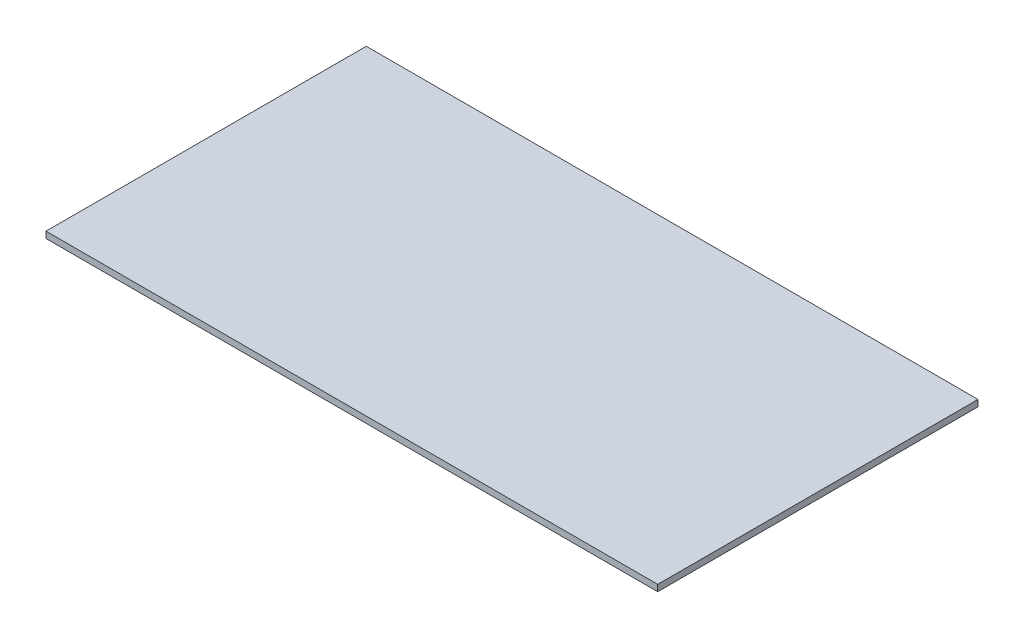
ISO-10303-21;
HEADER;
FILE_DESCRIPTION(('STEP AP214'),'2;1');
FILE_NAME('part.step','',(''),(''),'','','');
FILE_SCHEMA(('AUTOMOTIVE_DESIGN { 1 0 10303 214 1 1 1 1 }'));
ENDSEC;
DATA;
#1=APPLICATION_CONTEXT('core data for automotive mechanical design processes');
#2=APPLICATION_PROTOCOL_DEFINITION('international standard','automotive_design',2000,#1);
#3=PRODUCT_CONTEXT('',#1,'mechanical');
#4=PRODUCT('Part','Part','',(#3));
#5=PRODUCT_RELATED_PRODUCT_CATEGORY('part','',(#4));
#6=PRODUCT_DEFINITION_FORMATION('','',#4);
#7=PRODUCT_DEFINITION_CONTEXT('part definition',#1,'design');
#8=PRODUCT_DEFINITION('design','',#6,#7);
#9=PRODUCT_DEFINITION_SHAPE('','',#8);
#10=(LENGTH_UNIT() NAMED_UNIT(*) SI_UNIT(.MILLI.,.METRE.));
#11=(NAMED_UNIT(*) PLANE_ANGLE_UNIT() SI_UNIT($,.RADIAN.));
#12=(NAMED_UNIT(*) SI_UNIT($,.STERADIAN.) SOLID_ANGLE_UNIT());
#13=UNCERTAINTY_MEASURE_WITH_UNIT(LENGTH_MEASURE(1.E-05),#10,'distance_accuracy_value','');
#14=(GEOMETRIC_REPRESENTATION_CONTEXT(3) GLOBAL_UNCERTAINTY_ASSIGNED_CONTEXT((#13)) GLOBAL_UNIT_ASSIGNED_CONTEXT((#10,
#11,#12)) REPRESENTATION_CONTEXT('',''));
#15=CARTESIAN_POINT('',(0.,0.,0.));
#16=DIRECTION('',(0.,0.,1.));
#17=DIRECTION('',(1.,0.,0.));
#18=AXIS2_PLACEMENT_3D('',#15,#16,#17);
#19=CARTESIAN_POINT('',(-53.3215199226965,2.,-25.6912777809356));
#20=DIRECTION('',(1.,0.,0.));
#21=DIRECTION('',(0.,0.,-1.));
#22=AXIS2_PLACEMENT_3D('',#19,#20,#21);
#23=PLANE('',#22);
#24=DIRECTION('',(0.,0.,1.));
#25=VECTOR('',#24,1.);
#26=CARTESIAN_POINT('',(-53.3215199226965,0.,-25.6912777809356));
#27=LINE('',#26,#25);
#28=CARTESIAN_POINT('',(-53.3215199226965,0.,-25.6912777809356));
#29=VERTEX_POINT('',#28);
#30=CARTESIAN_POINT('',(-53.3215199226965,0.,74.3087222190644));
#31=VERTEX_POINT('',#30);
#32=EDGE_CURVE('E98',#29,#31,#27,.T.);
#33=ORIENTED_EDGE('',*,*,#32,.T.);
#34=DIRECTION('',(0.,-1.,0.));
#35=VECTOR('',#34,1.);
#36=CARTESIAN_POINT('',(-53.3215199226965,2.,74.3087222190644));
#37=LINE('',#36,#35);
#38=CARTESIAN_POINT('',(-53.3215199226965,2.,74.3087222190644));
#39=VERTEX_POINT('',#38);
#40=EDGE_CURVE('E11',#39,#31,#37,.T.);
#41=ORIENTED_EDGE('',*,*,#40,.F.);
#42=DIRECTION('',(0.,0.,1.));
#43=VECTOR('',#42,1.);
#44=CARTESIAN_POINT('',(-53.3215199226965,2.,-25.6912777809356));
#45=LINE('',#44,#43);
#46=CARTESIAN_POINT('',(-53.3215199226965,2.,-25.6912777809356));
#47=VERTEX_POINT('',#46);
#48=EDGE_CURVE('E86',#47,#39,#45,.T.);
#49=ORIENTED_EDGE('',*,*,#48,.F.);
#50=DIRECTION('',(0.,-1.,0.));
#51=VECTOR('',#50,1.);
#52=CARTESIAN_POINT('',(-53.3215199226965,2.,-25.6912777809356));
#53=LINE('',#52,#51);
#54=EDGE_CURVE('E94',#47,#29,#53,.T.);
#55=ORIENTED_EDGE('',*,*,#54,.T.);
#56=EDGE_LOOP('',(#33,#41,#49,#55));
#57=FACE_BOUND('',#56,.T.);
#58=ADVANCED_FACE('F35',(#57),#23,.F.);
#59=CARTESIAN_POINT('',(-53.3215199226965,2.,74.3087222190644));
#60=DIRECTION('',(0.,0.,-1.));
#61=DIRECTION('',(-1.,0.,0.));
#62=AXIS2_PLACEMENT_3D('',#59,#60,#61);
#63=PLANE('',#62);
#64=DIRECTION('',(1.,0.,0.));
#65=VECTOR('',#64,1.);
#66=CARTESIAN_POINT('',(-53.3215199226965,0.,74.3087222190644));
#67=LINE('',#66,#65);
#68=CARTESIAN_POINT('',(137.678480077303,0.,74.3087222190644));
#69=VERTEX_POINT('',#68);
#70=EDGE_CURVE('E90',#31,#69,#67,.T.);
#71=ORIENTED_EDGE('',*,*,#70,.T.);
#72=DIRECTION('',(0.,-1.,0.));
#73=VECTOR('',#72,1.);
#74=CARTESIAN_POINT('',(137.678480077303,2.,74.3087222190644));
#75=LINE('',#74,#73);
#76=CARTESIAN_POINT('',(137.678480077303,2.,74.3087222190644));
#77=VERTEX_POINT('',#76);
#78=EDGE_CURVE('E43',#77,#69,#75,.T.);
#79=ORIENTED_EDGE('',*,*,#78,.F.);
#80=DIRECTION('',(1.,0.,0.));
#81=VECTOR('',#80,1.);
#82=CARTESIAN_POINT('',(-53.3215199226965,2.,74.3087222190644));
#83=LINE('',#82,#81);
#84=EDGE_CURVE('E81',#39,#77,#83,.T.);
#85=ORIENTED_EDGE('',*,*,#84,.F.);
#86=ORIENTED_EDGE('',*,*,#40,.T.);
#87=EDGE_LOOP('',(#71,#79,#85,#86));
#88=FACE_BOUND('',#87,.T.);
#89=ADVANCED_FACE('F89',(#88),#63,.F.);
#90=CARTESIAN_POINT('',(137.678480077303,2.,-25.6912777809356));
#91=DIRECTION('',(-1.,0.,0.));
#92=DIRECTION('',(0.,0.,1.));
#93=AXIS2_PLACEMENT_3D('',#90,#91,#92);
#94=PLANE('',#93);
#95=DIRECTION('',(0.,0.,-1.));
#96=VECTOR('',#95,1.);
#97=CARTESIAN_POINT('',(137.678480077303,0.,-25.6912777809356));
#98=LINE('',#97,#96);
#99=CARTESIAN_POINT('',(137.678480077303,0.,-25.6912777809356));
#100=VERTEX_POINT('',#99);
#101=EDGE_CURVE('E68',#69,#100,#98,.T.);
#102=ORIENTED_EDGE('',*,*,#101,.T.);
#103=DIRECTION('',(0.,-1.,0.));
#104=VECTOR('',#103,1.);
#105=CARTESIAN_POINT('',(137.678480077303,2.,-25.6912777809356));
#106=LINE('',#105,#104);
#107=CARTESIAN_POINT('',(137.678480077303,2.,-25.6912777809356));
#108=VERTEX_POINT('',#107);
#109=EDGE_CURVE('E91',#108,#100,#106,.T.);
#110=ORIENTED_EDGE('',*,*,#109,.F.);
#111=DIRECTION('',(0.,0.,-1.));
#112=VECTOR('',#111,1.);
#113=CARTESIAN_POINT('',(137.678480077303,2.,-25.6912777809356));
#114=LINE('',#113,#112);
#115=EDGE_CURVE('E84',#77,#108,#114,.T.);
#116=ORIENTED_EDGE('',*,*,#115,.F.);
#117=ORIENTED_EDGE('',*,*,#78,.T.);
#118=EDGE_LOOP('',(#102,#110,#116,#117));
#119=FACE_BOUND('',#118,.T.);
#120=ADVANCED_FACE('F92',(#119),#94,.F.);
#121=CARTESIAN_POINT('',(-53.3215199226965,2.,-25.6912777809356));
#122=DIRECTION('',(0.,0.,1.));
#123=DIRECTION('',(1.,0.,0.));
#124=AXIS2_PLACEMENT_3D('',#121,#122,#123);
#125=PLANE('',#124);
#126=DIRECTION('',(-1.,0.,0.));
#127=VECTOR('',#126,1.);
#128=CARTESIAN_POINT('',(-53.3215199226965,0.,-25.6912777809356));
#129=LINE('',#128,#127);
#130=EDGE_CURVE('E74',#100,#29,#129,.T.);
#131=ORIENTED_EDGE('',*,*,#130,.T.);
#132=ORIENTED_EDGE('',*,*,#54,.F.);
#133=DIRECTION('',(-1.,0.,0.));
#134=VECTOR('',#133,1.);
#135=CARTESIAN_POINT('',(-53.3215199226965,2.,-25.6912777809356));
#136=LINE('',#135,#134);
#137=EDGE_CURVE('E51',#108,#47,#136,.T.);
#138=ORIENTED_EDGE('',*,*,#137,.F.);
#139=ORIENTED_EDGE('',*,*,#109,.T.);
#140=EDGE_LOOP('',(#131,#132,#138,#139));
#141=FACE_BOUND('',#140,.T.);
#142=ADVANCED_FACE('F105',(#141),#125,.F.);
#143=CARTESIAN_POINT('',(0.,2.,0.));
#144=DIRECTION('',(0.,1.,0.));
#145=DIRECTION('',(0.,0.,1.));
#146=AXIS2_PLACEMENT_3D('',#143,#144,#145);
#147=PLANE('',#146);
#148=ORIENTED_EDGE('',*,*,#48,.T.);
#149=ORIENTED_EDGE('',*,*,#84,.T.);
#150=ORIENTED_EDGE('',*,*,#115,.T.);
#151=ORIENTED_EDGE('',*,*,#137,.T.);
#152=EDGE_LOOP('',(#148,#149,#150,#151));
#153=FACE_BOUND('',#152,.T.);
#154=ADVANCED_FACE('F82',(#153),#147,.T.);
#155=CARTESIAN_POINT('',(0.,0.,0.));
#156=DIRECTION('',(0.,1.,0.));
#157=DIRECTION('',(0.,0.,1.));
#158=AXIS2_PLACEMENT_3D('',#155,#156,#157);
#159=PLANE('',#158);
#160=ORIENTED_EDGE('',*,*,#32,.F.);
#161=ORIENTED_EDGE('',*,*,#130,.F.);
#162=ORIENTED_EDGE('',*,*,#101,.F.);
#163=ORIENTED_EDGE('',*,*,#70,.F.);
#164=EDGE_LOOP('',(#160,#161,#162,#163));
#165=FACE_BOUND('',#164,.T.);
#166=ADVANCED_FACE('F108',(#165),#159,.F.);
#167=CLOSED_SHELL('',(#58,#89,#120,#142,#154,#166));
#168=MANIFOLD_SOLID_BREP('B2',#167);
#169=ADVANCED_BREP_SHAPE_REPRESENTATION('',(#18,#168),#14);
#170=SHAPE_DEFINITION_REPRESENTATION(#9,#169);
ENDSEC;
END-ISO-10303-21;
